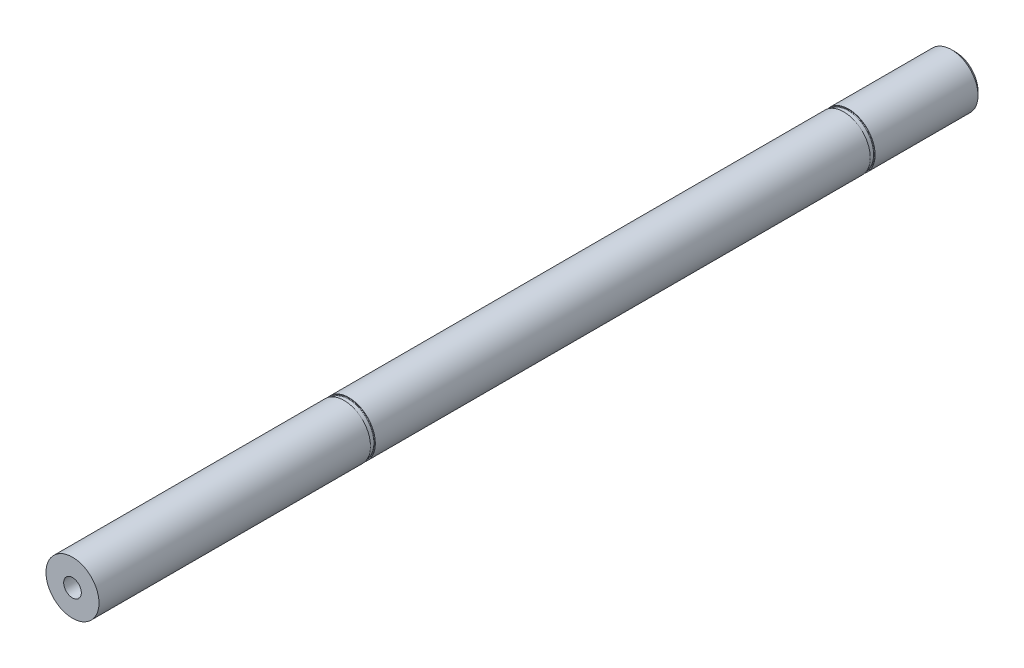
ISO-10303-21;
HEADER;
FILE_DESCRIPTION(('STEP AP214'),'2;1');
FILE_NAME('part.step','',(''),(''),'','','');
FILE_SCHEMA(('AUTOMOTIVE_DESIGN { 1 0 10303 214 1 1 1 1 }'));
ENDSEC;
DATA;
#1=APPLICATION_CONTEXT('core data for automotive mechanical design processes');
#2=APPLICATION_PROTOCOL_DEFINITION('international standard','automotive_design',2000,#1);
#3=PRODUCT_CONTEXT('',#1,'mechanical');
#4=PRODUCT('Part','Part','',(#3));
#5=PRODUCT_RELATED_PRODUCT_CATEGORY('part','',(#4));
#6=PRODUCT_DEFINITION_FORMATION('','',#4);
#7=PRODUCT_DEFINITION_CONTEXT('part definition',#1,'design');
#8=PRODUCT_DEFINITION('design','',#6,#7);
#9=PRODUCT_DEFINITION_SHAPE('','',#8);
#10=(LENGTH_UNIT() NAMED_UNIT(*) SI_UNIT(.MILLI.,.METRE.));
#11=(NAMED_UNIT(*) PLANE_ANGLE_UNIT() SI_UNIT($,.RADIAN.));
#12=(NAMED_UNIT(*) SI_UNIT($,.STERADIAN.) SOLID_ANGLE_UNIT());
#13=UNCERTAINTY_MEASURE_WITH_UNIT(LENGTH_MEASURE(1.E-05),#10,'distance_accuracy_value','');
#14=(GEOMETRIC_REPRESENTATION_CONTEXT(3) GLOBAL_UNCERTAINTY_ASSIGNED_CONTEXT((#13)) GLOBAL_UNIT_ASSIGNED_CONTEXT((#10,
#11,#12)) REPRESENTATION_CONTEXT('',''));
#15=CARTESIAN_POINT('',(0.,0.,0.));
#16=DIRECTION('',(0.,0.,1.));
#17=DIRECTION('',(1.,0.,0.));
#18=AXIS2_PLACEMENT_3D('',#15,#16,#17);
#19=CARTESIAN_POINT('',(0.,0.,100.));
#20=DIRECTION('',(0.,0.,-1.));
#21=DIRECTION('',(-1.,0.,0.));
#22=AXIS2_PLACEMENT_3D('',#19,#20,#21);
#23=CYLINDRICAL_SURFACE('',#22,6.);
#24=CARTESIAN_POINT('',(0.,0.,37.4));
#25=DIRECTION('',(0.,0.,1.));
#26=DIRECTION('',(1.,0.,0.));
#27=AXIS2_PLACEMENT_3D('',#24,#25,#26);
#28=CIRCLE('',#27,6.);
#29=CARTESIAN_POINT('',(6.,0.,37.4));
#30=VERTEX_POINT('',#29);
#31=EDGE_CURVE('E48',#30,#30,#28,.T.);
#32=ORIENTED_EDGE('',*,*,#31,.F.);
#33=EDGE_LOOP('',(#32));
#34=FACE_BOUND('',#33,.T.);
#35=CARTESIAN_POINT('',(0.,0.,-74.7));
#36=DIRECTION('',(0.,0.,-1.));
#37=DIRECTION('',(-1.,0.,0.));
#38=AXIS2_PLACEMENT_3D('',#35,#36,#37);
#39=CIRCLE('',#38,6.);
#40=CARTESIAN_POINT('',(-6.,0.,-74.7));
#41=VERTEX_POINT('',#40);
#42=EDGE_CURVE('E35',#41,#41,#39,.T.);
#43=ORIENTED_EDGE('',*,*,#42,.F.);
#44=EDGE_LOOP('',(#43));
#45=FACE_BOUND('',#44,.T.);
#46=ADVANCED_FACE('F31',(#34,#45),#23,.T.);
#47=CARTESIAN_POINT('',(0.,0.,-99.1));
#48=DIRECTION('',(0.,0.,1.));
#49=DIRECTION('',(1.,0.,0.));
#50=AXIS2_PLACEMENT_3D('',#47,#48,#49);
#51=CIRCLE('',#50,6.);
#52=CARTESIAN_POINT('',(5.99999999999999,0.,-99.1));
#53=VERTEX_POINT('',#52);
#54=EDGE_CURVE('E39',#53,#53,#51,.T.);
#55=ORIENTED_EDGE('',*,*,#54,.T.);
#56=EDGE_LOOP('',(#55));
#57=FACE_BOUND('',#56,.T.);
#58=CARTESIAN_POINT('',(0.,0.,-75.8000000000001));
#59=DIRECTION('',(0.,0.,1.));
#60=DIRECTION('',(1.,0.,0.));
#61=AXIS2_PLACEMENT_3D('',#58,#59,#60);
#62=CIRCLE('',#61,6.);
#63=CARTESIAN_POINT('',(6.,0.,-75.8000000000001));
#64=VERTEX_POINT('',#63);
#65=EDGE_CURVE('E55',#64,#64,#62,.T.);
#66=ORIENTED_EDGE('',*,*,#65,.F.);
#67=EDGE_LOOP('',(#66));
#68=FACE_BOUND('',#67,.T.);
#69=ADVANCED_FACE('F94',(#57,#68),#23,.T.);
#70=CARTESIAN_POINT('',(0.,0.,100.));
#71=DIRECTION('',(0.,0.,1.));
#72=DIRECTION('',(1.,0.,0.));
#73=AXIS2_PLACEMENT_3D('',#70,#71,#72);
#74=CIRCLE('',#73,6.);
#75=CARTESIAN_POINT('',(6.,0.,100.));
#76=VERTEX_POINT('',#75);
#77=EDGE_CURVE('E44',#76,#76,#74,.T.);
#78=ORIENTED_EDGE('',*,*,#77,.F.);
#79=EDGE_LOOP('',(#78));
#80=FACE_BOUND('',#79,.T.);
#81=CARTESIAN_POINT('',(0.,0.,38.5));
#82=DIRECTION('',(0.,0.,-1.));
#83=DIRECTION('',(-1.,0.,0.));
#84=AXIS2_PLACEMENT_3D('',#81,#82,#83);
#85=CIRCLE('',#84,6.);
#86=CARTESIAN_POINT('',(-6.,0.,38.5));
#87=VERTEX_POINT('',#86);
#88=EDGE_CURVE('E51',#87,#87,#85,.T.);
#89=ORIENTED_EDGE('',*,*,#88,.F.);
#90=EDGE_LOOP('',(#89));
#91=FACE_BOUND('',#90,.T.);
#92=ADVANCED_FACE('F91',(#80,#91),#23,.T.);
#93=CARTESIAN_POINT('',(0.,0.,100.));
#94=DIRECTION('',(0.,0.,1.));
#95=DIRECTION('',(1.,0.,0.));
#96=AXIS2_PLACEMENT_3D('',#93,#94,#95);
#97=PLANE('',#96);
#98=CARTESIAN_POINT('',(0.,0.,100.));
#99=DIRECTION('',(0.,0.,1.));
#100=DIRECTION('',(1.,0.,0.));
#101=AXIS2_PLACEMENT_3D('',#98,#99,#100);
#102=CIRCLE('',#101,2.);
#103=CARTESIAN_POINT('',(2.,0.,100.));
#104=VERTEX_POINT('',#103);
#105=EDGE_CURVE('E54',#104,#104,#102,.T.);
#106=ORIENTED_EDGE('',*,*,#105,.F.);
#107=EDGE_LOOP('',(#106));
#108=FACE_BOUND('',#107,.T.);
#109=ORIENTED_EDGE('',*,*,#77,.T.);
#110=EDGE_LOOP('',(#109));
#111=FACE_BOUND('',#110,.T.);
#112=ADVANCED_FACE('F89',(#108,#111),#97,.T.);
#113=CARTESIAN_POINT('',(0.,0.,-100.));
#114=DIRECTION('',(0.,0.,1.));
#115=DIRECTION('',(1.,0.,0.));
#116=AXIS2_PLACEMENT_3D('',#113,#114,#115);
#117=PLANE('',#116);
#118=CARTESIAN_POINT('',(0.,0.,-100.));
#119=DIRECTION('',(0.,0.,1.));
#120=DIRECTION('',(1.,0.,0.));
#121=AXIS2_PLACEMENT_3D('',#118,#119,#120);
#122=CIRCLE('',#121,2.);
#123=CARTESIAN_POINT('',(2.,0.,-100.));
#124=VERTEX_POINT('',#123);
#125=EDGE_CURVE('E84',#124,#124,#122,.T.);
#126=ORIENTED_EDGE('',*,*,#125,.T.);
#127=EDGE_LOOP('',(#126));
#128=FACE_BOUND('',#127,.T.);
#129=CARTESIAN_POINT('',(0.,0.,-100.));
#130=DIRECTION('',(0.,0.,1.));
#131=DIRECTION('',(1.,0.,0.));
#132=AXIS2_PLACEMENT_3D('',#129,#130,#131);
#133=CIRCLE('',#132,5.09999999999999);
#134=CARTESIAN_POINT('',(5.09999999999999,0.,-100.));
#135=VERTEX_POINT('',#134);
#136=EDGE_CURVE('E10',#135,#135,#133,.F.);
#137=ORIENTED_EDGE('',*,*,#136,.T.);
#138=EDGE_LOOP('',(#137));
#139=FACE_BOUND('',#138,.T.);
#140=ADVANCED_FACE('F123',(#128,#139),#117,.F.);
#141=CARTESIAN_POINT('',(0.,0.,-99.1));
#142=DIRECTION('',(0.,0.,1.));
#143=DIRECTION('',(1.,0.,0.));
#144=AXIS2_PLACEMENT_3D('',#141,#142,#143);
#145=CONICAL_SURFACE('',#144,6.,0.785398163397446);
#146=CARTESIAN_POINT('',(5.09999999999999,0.,-100.));
#147=CARTESIAN_POINT('',(5.10937499999999,0.,-99.990625));
#148=CARTESIAN_POINT('',(5.11874999999999,0.,-99.98125));
#149=CARTESIAN_POINT('',(5.13749999999999,0.,-99.9625));
#150=CARTESIAN_POINT('',(5.14687499999999,0.,-99.953125));
#151=CARTESIAN_POINT('',(5.16562499999999,0.,-99.934375));
#152=CARTESIAN_POINT('',(5.17499999999998,0.,-99.925));
#153=CARTESIAN_POINT('',(5.19374999999999,0.,-99.90625));
#154=CARTESIAN_POINT('',(5.20312499999999,0.,-99.896875));
#155=CARTESIAN_POINT('',(5.22187499999999,0.,-99.878125));
#156=CARTESIAN_POINT('',(5.23124999999999,0.,-99.86875));
#157=CARTESIAN_POINT('',(5.24999999999999,0.,-99.85));
#158=CARTESIAN_POINT('',(5.25937499999999,0.,-99.840625));
#159=CARTESIAN_POINT('',(5.27812499999999,0.,-99.821875));
#160=CARTESIAN_POINT('',(5.28749999999999,0.,-99.8125));
#161=CARTESIAN_POINT('',(5.30624999999999,0.,-99.79375));
#162=CARTESIAN_POINT('',(5.31562499999999,0.,-99.784375));
#163=CARTESIAN_POINT('',(5.33437499999999,0.,-99.765625));
#164=CARTESIAN_POINT('',(5.34374999999999,0.,-99.75625));
#165=CARTESIAN_POINT('',(5.36249999999999,0.,-99.7375));
#166=CARTESIAN_POINT('',(5.37187499999999,0.,-99.728125));
#167=CARTESIAN_POINT('',(5.39062499999999,0.,-99.709375));
#168=CARTESIAN_POINT('',(5.39999999999999,0.,-99.7));
#169=CARTESIAN_POINT('',(5.41874999999999,0.,-99.68125));
#170=CARTESIAN_POINT('',(5.42812499999999,0.,-99.671875));
#171=CARTESIAN_POINT('',(5.44687499999999,0.,-99.653125));
#172=CARTESIAN_POINT('',(5.45624999999999,0.,-99.64375));
#173=CARTESIAN_POINT('',(5.47499999999999,0.,-99.625));
#174=CARTESIAN_POINT('',(5.48437499999999,0.,-99.615625));
#175=CARTESIAN_POINT('',(5.50312499999999,0.,-99.596875));
#176=CARTESIAN_POINT('',(5.51249999999999,0.,-99.5875));
#177=CARTESIAN_POINT('',(5.53124999999999,0.,-99.56875));
#178=CARTESIAN_POINT('',(5.54062499999999,0.,-99.559375));
#179=CARTESIAN_POINT('',(5.55937499999999,0.,-99.540625));
#180=CARTESIAN_POINT('',(5.56874999999999,0.,-99.53125));
#181=CARTESIAN_POINT('',(5.58749999999999,0.,-99.5125));
#182=CARTESIAN_POINT('',(5.59687499999999,0.,-99.503125));
#183=CARTESIAN_POINT('',(5.61562499999999,0.,-99.484375));
#184=CARTESIAN_POINT('',(5.62499999999999,0.,-99.475));
#185=CARTESIAN_POINT('',(5.64374999999999,0.,-99.45625));
#186=CARTESIAN_POINT('',(5.65312499999999,0.,-99.446875));
#187=CARTESIAN_POINT('',(5.67187499999999,0.,-99.428125));
#188=CARTESIAN_POINT('',(5.68124999999999,0.,-99.41875));
#189=CARTESIAN_POINT('',(5.69999999999999,0.,-99.4));
#190=CARTESIAN_POINT('',(5.70937499999999,0.,-99.390625));
#191=CARTESIAN_POINT('',(5.72812499999999,0.,-99.371875));
#192=CARTESIAN_POINT('',(5.73749999999999,0.,-99.3625));
#193=CARTESIAN_POINT('',(5.75624999999999,0.,-99.34375));
#194=CARTESIAN_POINT('',(5.76562499999999,0.,-99.334375));
#195=CARTESIAN_POINT('',(5.78437499999999,0.,-99.315625));
#196=CARTESIAN_POINT('',(5.79374999999999,0.,-99.30625));
#197=CARTESIAN_POINT('',(5.81249999999999,0.,-99.2875));
#198=CARTESIAN_POINT('',(5.82187499999999,0.,-99.278125));
#199=CARTESIAN_POINT('',(5.84062499999999,0.,-99.259375));
#200=CARTESIAN_POINT('',(5.84999999999999,0.,-99.25));
#201=CARTESIAN_POINT('',(5.86874999999999,0.,-99.23125));
#202=CARTESIAN_POINT('',(5.87812499999999,0.,-99.221875));
#203=CARTESIAN_POINT('',(5.89687499999999,0.,-99.203125));
#204=CARTESIAN_POINT('',(5.90624999999999,0.,-99.19375));
#205=CARTESIAN_POINT('',(5.92499999999999,0.,-99.175));
#206=CARTESIAN_POINT('',(5.93437499999999,0.,-99.165625));
#207=CARTESIAN_POINT('',(5.95312499999999,0.,-99.146875));
#208=CARTESIAN_POINT('',(5.96249999999999,0.,-99.1375));
#209=CARTESIAN_POINT('',(5.98124999999999,0.,-99.11875));
#210=CARTESIAN_POINT('',(5.99062499999999,0.,-99.109375));
#211=CARTESIAN_POINT('',(5.99999999999999,0.,-99.1));
#212=B_SPLINE_CURVE_WITH_KNOTS('',3,(#146,#147,#148,#149,#150,#151,#152,#153,#154,#155,#156,
#157,#158,#159,#160,#161,#162,#163,#164,#165,#166,#167,#168,#169,#170,#171,#172,#173,#174,#175,
#176,#177,#178,#179,#180,#181,#182,#183,#184,#185,#186,#187,#188,#189,#190,#191,#192,#193,#194,
#195,#196,#197,#198,#199,#200,#201,#202,#203,#204,#205,#206,#207,#208,#209,#210,#211),
.UNSPECIFIED.,.F.,.F.,(4,2,2,2,2,2,2,2,2,2,2,2,2,2,2,2,2,2,2,2,2,2,2,2,2,2,2,2,2,2,2,2,4),(0.,
0.0397747564417457,0.0795495128834919,0.119324269325238,0.159099025766975,0.198873782208721,
0.238648538650467,0.278423295092213,0.318198051533949,0.357972807975696,0.397747564417442,
0.437522320859188,0.477297077300925,0.517071833742671,0.556846590184417,0.596621346626163,
0.636396103067899,0.676170859509646,0.715945615951392,0.755720372393138,0.795495128834874,
0.835269885276621,0.875044641718366,0.914819398160113,0.954594154601859,0.994368911043595,
1.03414366748534,1.07391842392709,1.11369318036883,1.15346793681057,1.19324269325232,
1.23301744969406,1.27279220613581),.UNSPECIFIED.);
#213=EDGE_CURVE('BSEAM33',#135,#53,#212,.T.);
#214=ORIENTED_EDGE('',*,*,#136,.F.);
#215=ORIENTED_EDGE('',*,*,#54,.F.);
#216=ORIENTED_EDGE('',*,*,#213,.T.);
#217=ORIENTED_EDGE('',*,*,#213,.F.);
#218=EDGE_LOOP('',(#214,#216,#215,#217));
#219=FACE_BOUND('',#218,.T.);
#220=ADVANCED_FACE('F33',(#219),#145,.T.);
#221=CARTESIAN_POINT('',(0.,0.,-100.));
#222=DIRECTION('',(0.,0.,1.));
#223=DIRECTION('',(1.,0.,0.));
#224=AXIS2_PLACEMENT_3D('',#221,#222,#223);
#225=CYLINDRICAL_SURFACE('',#224,2.);
#226=ORIENTED_EDGE('',*,*,#125,.F.);
#227=EDGE_LOOP('',(#226));
#228=FACE_BOUND('',#227,.T.);
#229=ORIENTED_EDGE('',*,*,#105,.T.);
#230=EDGE_LOOP('',(#229));
#231=FACE_BOUND('',#230,.T.);
#232=ADVANCED_FACE('F100',(#228,#231),#225,.F.);
#233=CARTESIAN_POINT('',(0.,5.86,38.5));
#234=DIRECTION('',(0.,0.,-1.));
#235=DIRECTION('',(-1.,0.,0.));
#236=AXIS2_PLACEMENT_3D('',#233,#234,#235);
#237=PLANE('',#236);
#238=CARTESIAN_POINT('',(0.,0.,38.5));
#239=DIRECTION('',(0.,0.,-1.));
#240=DIRECTION('',(-1.,0.,0.));
#241=AXIS2_PLACEMENT_3D('',#238,#239,#240);
#242=CIRCLE('',#241,5.86);
#243=CARTESIAN_POINT('',(-5.86,0.,38.5));
#244=VERTEX_POINT('',#243);
#245=EDGE_CURVE('E52',#244,#244,#242,.T.);
#246=ORIENTED_EDGE('',*,*,#245,.F.);
#247=EDGE_LOOP('',(#246));
#248=FACE_BOUND('',#247,.T.);
#249=ORIENTED_EDGE('',*,*,#88,.T.);
#250=EDGE_LOOP('',(#249));
#251=FACE_BOUND('',#250,.T.);
#252=ADVANCED_FACE('F97',(#248,#251),#237,.T.);
#253=CARTESIAN_POINT('',(0.,7.2,37.4));
#254=DIRECTION('',(0.,0.,1.));
#255=DIRECTION('',(1.,0.,0.));
#256=AXIS2_PLACEMENT_3D('',#253,#254,#255);
#257=PLANE('',#256);
#258=CARTESIAN_POINT('',(0.,0.,37.4));
#259=DIRECTION('',(0.,0.,-1.));
#260=DIRECTION('',(-1.,0.,0.));
#261=AXIS2_PLACEMENT_3D('',#258,#259,#260);
#262=CIRCLE('',#261,5.86);
#263=CARTESIAN_POINT('',(-5.86,0.,37.4));
#264=VERTEX_POINT('',#263);
#265=EDGE_CURVE('E61',#264,#264,#262,.T.);
#266=ORIENTED_EDGE('',*,*,#265,.T.);
#267=EDGE_LOOP('',(#266));
#268=FACE_BOUND('',#267,.T.);
#269=ORIENTED_EDGE('',*,*,#31,.T.);
#270=EDGE_LOOP('',(#269));
#271=FACE_BOUND('',#270,.T.);
#272=ADVANCED_FACE('F99',(#268,#271),#257,.T.);
#273=CARTESIAN_POINT('',(0.,0.,38.39));
#274=DIRECTION('',(0.,0.,-1.));
#275=DIRECTION('',(-1.,0.,0.));
#276=AXIS2_PLACEMENT_3D('',#273,#274,#275);
#277=TOROIDAL_SURFACE('',#276,5.86,0.109999999999999);
#278=ORIENTED_EDGE('',*,*,#245,.T.);
#279=EDGE_LOOP('',(#278));
#280=FACE_BOUND('',#279,.T.);
#281=CARTESIAN_POINT('',(0.,0.,38.39));
#282=DIRECTION('',(0.,0.,-1.));
#283=DIRECTION('',(-1.,0.,0.));
#284=AXIS2_PLACEMENT_3D('',#281,#282,#283);
#285=CIRCLE('',#284,5.75);
#286=CARTESIAN_POINT('',(-5.75,0.,38.39));
#287=VERTEX_POINT('',#286);
#288=EDGE_CURVE('E77',#287,#287,#285,.T.);
#289=ORIENTED_EDGE('',*,*,#288,.F.);
#290=EDGE_LOOP('',(#289));
#291=FACE_BOUND('',#290,.T.);
#292=ADVANCED_FACE('F107',(#280,#291),#277,.F.);
#293=CARTESIAN_POINT('',(0.,0.,150.));
#294=DIRECTION('',(0.,0.,-1.));
#295=DIRECTION('',(-1.,0.,0.));
#296=AXIS2_PLACEMENT_3D('',#293,#294,#295);
#297=CYLINDRICAL_SURFACE('',#296,5.75);
#298=ORIENTED_EDGE('',*,*,#288,.T.);
#299=EDGE_LOOP('',(#298));
#300=FACE_BOUND('',#299,.T.);
#301=CARTESIAN_POINT('',(0.,0.,37.51));
#302=DIRECTION('',(0.,0.,-1.));
#303=DIRECTION('',(-1.,0.,0.));
#304=AXIS2_PLACEMENT_3D('',#301,#302,#303);
#305=CIRCLE('',#304,5.75);
#306=CARTESIAN_POINT('',(-5.75,0.,37.51));
#307=VERTEX_POINT('',#306);
#308=EDGE_CURVE('E74',#307,#307,#305,.T.);
#309=ORIENTED_EDGE('',*,*,#308,.F.);
#310=EDGE_LOOP('',(#309));
#311=FACE_BOUND('',#310,.T.);
#312=ADVANCED_FACE('F172',(#300,#311),#297,.T.);
#313=CARTESIAN_POINT('',(0.,0.,37.51));
#314=DIRECTION('',(0.,0.,-1.));
#315=DIRECTION('',(-1.,0.,0.));
#316=AXIS2_PLACEMENT_3D('',#313,#314,#315);
#317=TOROIDAL_SURFACE('',#316,5.86,0.109999999999999);
#318=ORIENTED_EDGE('',*,*,#308,.T.);
#319=EDGE_LOOP('',(#318));
#320=FACE_BOUND('',#319,.T.);
#321=ORIENTED_EDGE('',*,*,#265,.F.);
#322=EDGE_LOOP('',(#321));
#323=FACE_BOUND('',#322,.T.);
#324=ADVANCED_FACE('F181',(#320,#323),#317,.F.);
#325=CARTESIAN_POINT('',(0.,5.86,-74.7));
#326=DIRECTION('',(0.,0.,-1.));
#327=DIRECTION('',(-1.,0.,0.));
#328=AXIS2_PLACEMENT_3D('',#325,#326,#327);
#329=PLANE('',#328);
#330=CARTESIAN_POINT('',(0.,0.,-74.7));
#331=DIRECTION('',(0.,0.,-1.));
#332=DIRECTION('',(-1.,0.,0.));
#333=AXIS2_PLACEMENT_3D('',#330,#331,#332);
#334=CIRCLE('',#333,5.86);
#335=CARTESIAN_POINT('',(-5.86,0.,-74.7));
#336=VERTEX_POINT('',#335);
#337=EDGE_CURVE('E57',#336,#336,#334,.T.);
#338=ORIENTED_EDGE('',*,*,#337,.F.);
#339=EDGE_LOOP('',(#338));
#340=FACE_BOUND('',#339,.T.);
#341=ORIENTED_EDGE('',*,*,#42,.T.);
#342=EDGE_LOOP('',(#341));
#343=FACE_BOUND('',#342,.T.);
#344=ADVANCED_FACE('F190',(#340,#343),#329,.T.);
#345=CARTESIAN_POINT('',(0.,7.2,-75.8000000000001));
#346=DIRECTION('',(0.,0.,1.));
#347=DIRECTION('',(1.,0.,0.));
#348=AXIS2_PLACEMENT_3D('',#345,#346,#347);
#349=PLANE('',#348);
#350=CARTESIAN_POINT('',(0.,0.,-75.8000000000001));
#351=DIRECTION('',(0.,0.,-1.));
#352=DIRECTION('',(-1.,0.,0.));
#353=AXIS2_PLACEMENT_3D('',#350,#351,#352);
#354=CIRCLE('',#353,5.86);
#355=CARTESIAN_POINT('',(-5.86,0.,-75.8000000000001));
#356=VERTEX_POINT('',#355);
#357=EDGE_CURVE('E259',#356,#356,#354,.T.);
#358=ORIENTED_EDGE('',*,*,#357,.T.);
#359=EDGE_LOOP('',(#358));
#360=FACE_BOUND('',#359,.T.);
#361=ORIENTED_EDGE('',*,*,#65,.T.);
#362=EDGE_LOOP('',(#361));
#363=FACE_BOUND('',#362,.T.);
#364=ADVANCED_FACE('F211',(#360,#363),#349,.T.);
#365=CARTESIAN_POINT('',(0.,0.,-74.81));
#366=DIRECTION('',(0.,0.,-1.));
#367=DIRECTION('',(-1.,0.,0.));
#368=AXIS2_PLACEMENT_3D('',#365,#366,#367);
#369=TOROIDAL_SURFACE('',#368,5.86,0.109999999999999);
#370=ORIENTED_EDGE('',*,*,#337,.T.);
#371=EDGE_LOOP('',(#370));
#372=FACE_BOUND('',#371,.T.);
#373=CARTESIAN_POINT('',(0.,0.,-74.81));
#374=DIRECTION('',(0.,0.,-1.));
#375=DIRECTION('',(-1.,0.,0.));
#376=AXIS2_PLACEMENT_3D('',#373,#374,#375);
#377=CIRCLE('',#376,5.75);
#378=CARTESIAN_POINT('',(-5.75,0.,-74.81));
#379=VERTEX_POINT('',#378);
#380=EDGE_CURVE('E63',#379,#379,#377,.T.);
#381=ORIENTED_EDGE('',*,*,#380,.F.);
#382=EDGE_LOOP('',(#381));
#383=FACE_BOUND('',#382,.T.);
#384=ADVANCED_FACE('F221',(#372,#383),#369,.F.);
#385=CARTESIAN_POINT('',(0.,0.,150.));
#386=DIRECTION('',(0.,0.,-1.));
#387=DIRECTION('',(-1.,0.,0.));
#388=AXIS2_PLACEMENT_3D('',#385,#386,#387);
#389=CYLINDRICAL_SURFACE('',#388,5.75);
#390=ORIENTED_EDGE('',*,*,#380,.T.);
#391=EDGE_LOOP('',(#390));
#392=FACE_BOUND('',#391,.T.);
#393=CARTESIAN_POINT('',(0.,0.,-75.6900000000001));
#394=DIRECTION('',(0.,0.,-1.));
#395=DIRECTION('',(-1.,0.,0.));
#396=AXIS2_PLACEMENT_3D('',#393,#394,#395);
#397=CIRCLE('',#396,5.75);
#398=CARTESIAN_POINT('',(-5.75,0.,-75.6900000000001));
#399=VERTEX_POINT('',#398);
#400=EDGE_CURVE('E68',#399,#399,#397,.T.);
#401=ORIENTED_EDGE('',*,*,#400,.F.);
#402=EDGE_LOOP('',(#401));
#403=FACE_BOUND('',#402,.T.);
#404=ADVANCED_FACE('F231',(#392,#403),#389,.T.);
#405=CARTESIAN_POINT('',(0.,0.,-75.6900000000001));
#406=DIRECTION('',(0.,0.,-1.));
#407=DIRECTION('',(-1.,0.,0.));
#408=AXIS2_PLACEMENT_3D('',#405,#406,#407);
#409=TOROIDAL_SURFACE('',#408,5.86,0.109999999999999);
#410=ORIENTED_EDGE('',*,*,#400,.T.);
#411=EDGE_LOOP('',(#410));
#412=FACE_BOUND('',#411,.T.);
#413=ORIENTED_EDGE('',*,*,#357,.F.);
#414=EDGE_LOOP('',(#413));
#415=FACE_BOUND('',#414,.T.);
#416=ADVANCED_FACE('F240',(#412,#415),#409,.F.);
#417=CLOSED_SHELL('',(#46,#69,#92,#112,#140,#220,#232,#252,#272,#292,#312,#324,#344,#364,#384,
#404,#416));
#418=MANIFOLD_SOLID_BREP('B2',#417);
#419=ADVANCED_BREP_SHAPE_REPRESENTATION('',(#18,#418),#14);
#420=SHAPE_DEFINITION_REPRESENTATION(#9,#419);
ENDSEC;
END-ISO-10303-21;
